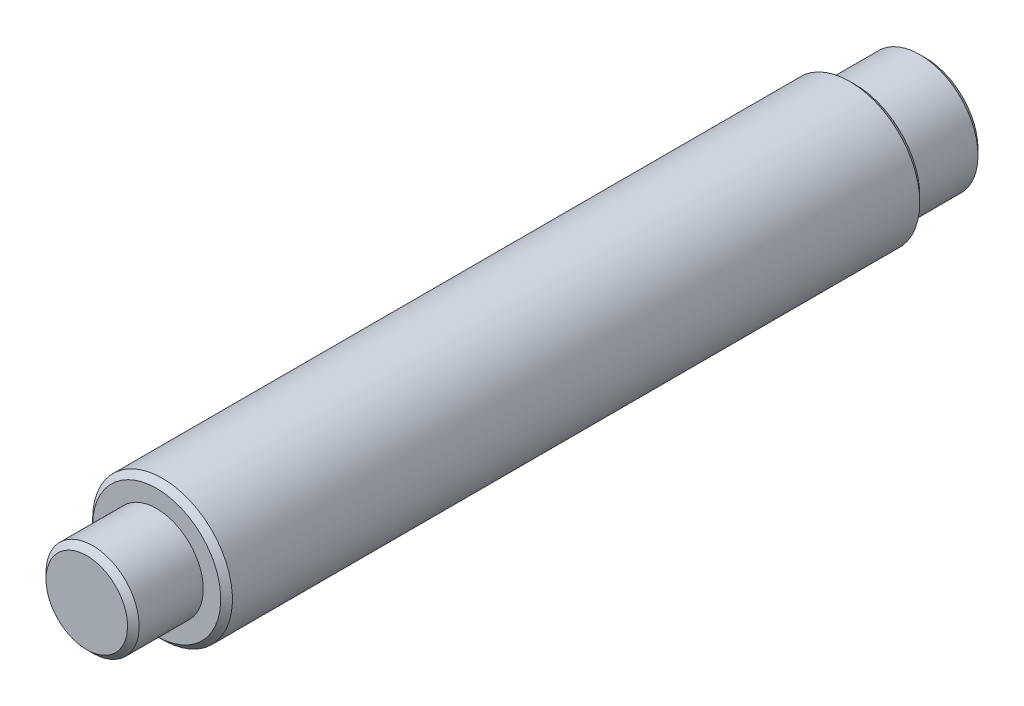
ISO-10303-21;
HEADER;
FILE_DESCRIPTION(('STEP AP214'),'2;1');
FILE_NAME('part.step','',(''),(''),'','','');
FILE_SCHEMA(('AUTOMOTIVE_DESIGN { 1 0 10303 214 1 1 1 1 }'));
ENDSEC;
DATA;
#1=APPLICATION_CONTEXT('core data for automotive mechanical design processes');
#2=APPLICATION_PROTOCOL_DEFINITION('international standard','automotive_design',2000,#1);
#3=PRODUCT_CONTEXT('',#1,'mechanical');
#4=PRODUCT('Part','Part','',(#3));
#5=PRODUCT_RELATED_PRODUCT_CATEGORY('part','',(#4));
#6=PRODUCT_DEFINITION_FORMATION('','',#4);
#7=PRODUCT_DEFINITION_CONTEXT('part definition',#1,'design');
#8=PRODUCT_DEFINITION('design','',#6,#7);
#9=PRODUCT_DEFINITION_SHAPE('','',#8);
#10=(LENGTH_UNIT() NAMED_UNIT(*) SI_UNIT(.MILLI.,.METRE.));
#11=(NAMED_UNIT(*) PLANE_ANGLE_UNIT() SI_UNIT($,.RADIAN.));
#12=(NAMED_UNIT(*) SI_UNIT($,.STERADIAN.) SOLID_ANGLE_UNIT());
#13=UNCERTAINTY_MEASURE_WITH_UNIT(LENGTH_MEASURE(1.E-05),#10,'distance_accuracy_value','');
#14=(GEOMETRIC_REPRESENTATION_CONTEXT(3) GLOBAL_UNCERTAINTY_ASSIGNED_CONTEXT((#13)) GLOBAL_UNIT_ASSIGNED_CONTEXT((#10,
#11,#12)) REPRESENTATION_CONTEXT('',''));
#15=CARTESIAN_POINT('',(0.,0.,0.));
#16=DIRECTION('',(0.,0.,1.));
#17=DIRECTION('',(1.,0.,0.));
#18=AXIS2_PLACEMENT_3D('',#15,#16,#17);
#19=CARTESIAN_POINT('',(0.,0.,6.));
#20=DIRECTION('',(0.,0.,-0.999999999999999));
#21=DIRECTION('',(-1.,0.,0.));
#22=AXIS2_PLACEMENT_3D('',#19,#20,#21);
#23=CYLINDRICAL_SURFACE('',#22,5.);
#24=CARTESIAN_POINT('',(0.,0.,0.500000000000007));
#25=DIRECTION('',(0.,0.,0.999999999999999));
#26=DIRECTION('',(1.,0.,0.));
#27=AXIS2_PLACEMENT_3D('',#24,#25,#26);
#28=CIRCLE('',#27,5.);
#29=CARTESIAN_POINT('',(-5.,0.,0.500000000000007));
#30=VERTEX_POINT('',#29);
#31=EDGE_CURVE('E42',#30,#30,#28,.T.);
#32=CARTESIAN_POINT('',(0.,0.,6.));
#33=DIRECTION('',(0.,0.,0.999999999999999));
#34=DIRECTION('',(1.,0.,0.));
#35=AXIS2_PLACEMENT_3D('',#32,#33,#34);
#36=CIRCLE('',#35,5.);
#37=CARTESIAN_POINT('',(-5.,0.,6.));
#38=VERTEX_POINT('',#37);
#39=EDGE_CURVE('E67',#38,#38,#36,.T.);
#40=CARTESIAN_POINT('',(-5.,0.,0.500000000000007));
#41=CARTESIAN_POINT('',(-5.,0.,0.557291666666674));
#42=CARTESIAN_POINT('',(-5.,0.,0.614583333333341));
#43=CARTESIAN_POINT('',(-5.,0.,0.729166666666674));
#44=CARTESIAN_POINT('',(-5.,0.,0.78645833333334));
#45=CARTESIAN_POINT('',(-5.,0.,0.901041666666674));
#46=CARTESIAN_POINT('',(-5.,0.,0.95833333333334));
#47=CARTESIAN_POINT('',(-5.,0.,1.07291666666667));
#48=CARTESIAN_POINT('',(-5.,0.,1.13020833333334));
#49=CARTESIAN_POINT('',(-5.,0.,1.24479166666667));
#50=CARTESIAN_POINT('',(-5.,0.,1.30208333333334));
#51=CARTESIAN_POINT('',(-5.,0.,1.41666666666667));
#52=CARTESIAN_POINT('',(-5.,0.,1.47395833333334));
#53=CARTESIAN_POINT('',(-5.,0.,1.58854166666667));
#54=CARTESIAN_POINT('',(-5.,0.,1.64583333333334));
#55=CARTESIAN_POINT('',(-5.,0.,1.76041666666667));
#56=CARTESIAN_POINT('',(-5.,0.,1.81770833333334));
#57=CARTESIAN_POINT('',(-5.,0.,1.93229166666667));
#58=CARTESIAN_POINT('',(-5.,0.,1.98958333333334));
#59=CARTESIAN_POINT('',(-5.,0.,2.10416666666667));
#60=CARTESIAN_POINT('',(-5.,0.,2.16145833333334));
#61=CARTESIAN_POINT('',(-5.,0.,2.27604166666667));
#62=CARTESIAN_POINT('',(-5.,0.,2.33333333333334));
#63=CARTESIAN_POINT('',(-5.,0.,2.44791666666667));
#64=CARTESIAN_POINT('',(-5.,0.,2.50520833333334));
#65=CARTESIAN_POINT('',(-5.,0.,2.61979166666667));
#66=CARTESIAN_POINT('',(-5.,0.,2.67708333333334));
#67=CARTESIAN_POINT('',(-5.,0.,2.79166666666667));
#68=CARTESIAN_POINT('',(-5.,0.,2.84895833333334));
#69=CARTESIAN_POINT('',(-5.,0.,2.96354166666667));
#70=CARTESIAN_POINT('',(-5.,0.,3.02083333333334));
#71=CARTESIAN_POINT('',(-5.,0.,3.13541666666667));
#72=CARTESIAN_POINT('',(-5.,0.,3.19270833333334));
#73=CARTESIAN_POINT('',(-5.,0.,3.30729166666667));
#74=CARTESIAN_POINT('',(-5.,0.,3.36458333333334));
#75=CARTESIAN_POINT('',(-5.,0.,3.47916666666667));
#76=CARTESIAN_POINT('',(-5.,0.,3.53645833333334));
#77=CARTESIAN_POINT('',(-5.,0.,3.65104166666667));
#78=CARTESIAN_POINT('',(-5.,0.,3.70833333333334));
#79=CARTESIAN_POINT('',(-5.,0.,3.82291666666667));
#80=CARTESIAN_POINT('',(-5.,0.,3.88020833333334));
#81=CARTESIAN_POINT('',(-5.,0.,3.99479166666667));
#82=CARTESIAN_POINT('',(-5.,0.,4.05208333333334));
#83=CARTESIAN_POINT('',(-5.,0.,4.16666666666667));
#84=CARTESIAN_POINT('',(-5.,0.,4.22395833333333));
#85=CARTESIAN_POINT('',(-5.,0.,4.33854166666667));
#86=CARTESIAN_POINT('',(-5.,0.,4.39583333333333));
#87=CARTESIAN_POINT('',(-5.,0.,4.51041666666667));
#88=CARTESIAN_POINT('',(-5.,0.,4.56770833333333));
#89=CARTESIAN_POINT('',(-5.,0.,4.68229166666667));
#90=CARTESIAN_POINT('',(-5.,0.,4.73958333333333));
#91=CARTESIAN_POINT('',(-5.,0.,4.85416666666667));
#92=CARTESIAN_POINT('',(-5.,0.,4.91145833333333));
#93=CARTESIAN_POINT('',(-5.,0.,5.02604166666667));
#94=CARTESIAN_POINT('',(-5.,0.,5.08333333333333));
#95=CARTESIAN_POINT('',(-5.,0.,5.19791666666667));
#96=CARTESIAN_POINT('',(-5.,0.,5.25520833333333));
#97=CARTESIAN_POINT('',(-5.,0.,5.36979166666667));
#98=CARTESIAN_POINT('',(-5.,0.,5.42708333333333));
#99=CARTESIAN_POINT('',(-5.,0.,5.54166666666667));
#100=CARTESIAN_POINT('',(-5.,0.,5.59895833333333));
#101=CARTESIAN_POINT('',(-5.,0.,5.71354166666667));
#102=CARTESIAN_POINT('',(-5.,0.,5.77083333333333));
#103=CARTESIAN_POINT('',(-5.,0.,5.88541666666666));
#104=CARTESIAN_POINT('',(-5.,0.,5.94270833333333));
#105=CARTESIAN_POINT('',(-5.,0.,6.));
#106=B_SPLINE_CURVE_WITH_KNOTS('',3,(#40,#41,#42,#43,#44,#45,#46,#47,#48,#49,#50,#51,#52,#53,
#54,#55,#56,#57,#58,#59,#60,#61,#62,#63,#64,#65,#66,#67,#68,#69,#70,#71,#72,#73,#74,#75,#76,#77,
#78,#79,#80,#81,#82,#83,#84,#85,#86,#87,#88,#89,#90,#91,#92,#93,#94,#95,#96,#97,#98,#99,#100,
#101,#102,#103,#104,#105),.UNSPECIFIED.,.F.,.F.,(4,2,2,2,2,2,2,2,2,2,2,2,2,2,2,2,2,2,2,2,2,2,2,
2,2,2,2,2,2,2,2,2,4),(0.,0.171875,0.343749999999999,0.515625,0.687499999999999,
0.859374999999999,1.03125,1.203125,1.375,1.546875,1.71875,1.890625,2.0625,2.234375,2.40625,
2.578125,2.75,2.921875,3.09375,3.26562499999999,3.43749999999999,3.60937499999999,
3.78124999999999,3.95312499999999,4.12499999999999,4.29687499999999,4.46874999999999,
4.64062499999999,4.81249999999999,4.98437499999999,5.15624999999999,5.32812499999999,
5.49999999999999),.UNSPECIFIED.);
#107=EDGE_CURVE('BSEAM30',#30,#38,#106,.T.);
#108=ORIENTED_EDGE('',*,*,#31,.T.);
#109=ORIENTED_EDGE('',*,*,#39,.F.);
#110=ORIENTED_EDGE('',*,*,#107,.T.);
#111=ORIENTED_EDGE('',*,*,#107,.F.);
#112=EDGE_LOOP('',(#108,#110,#109,#111));
#113=FACE_BOUND('',#112,.T.);
#114=ADVANCED_FACE('F30',(#113),#23,.T.);
#115=CARTESIAN_POINT('',(0.,0.,0.));
#116=DIRECTION('',(0.,0.,0.999999999999999));
#117=DIRECTION('',(1.,0.,0.));
#118=AXIS2_PLACEMENT_3D('',#115,#116,#117);
#119=PLANE('',#118);
#120=CARTESIAN_POINT('',(0.,0.,0.));
#121=DIRECTION('',(0.,0.,0.999999999999999));
#122=DIRECTION('',(1.,0.,0.));
#123=AXIS2_PLACEMENT_3D('',#120,#121,#122);
#124=CIRCLE('',#123,4.5);
#125=CARTESIAN_POINT('',(4.5,0.,0.));
#126=VERTEX_POINT('',#125);
#127=EDGE_CURVE('E10',#126,#126,#124,.F.);
#128=ORIENTED_EDGE('',*,*,#127,.T.);
#129=EDGE_LOOP('',(#128));
#130=FACE_BOUND('',#129,.T.);
#131=ADVANCED_FACE('F97',(#130),#119,.F.);
#132=CARTESIAN_POINT('',(0.,0.,6.));
#133=DIRECTION('',(0.,0.,0.999999999999999));
#134=DIRECTION('',(1.,0.,0.));
#135=AXIS2_PLACEMENT_3D('',#132,#133,#134);
#136=PLANE('',#135);
#137=CARTESIAN_POINT('',(0.,0.,6.));
#138=DIRECTION('',(0.,0.,0.999999999999999));
#139=DIRECTION('',(1.,0.,0.));
#140=AXIS2_PLACEMENT_3D('',#137,#138,#139);
#141=CIRCLE('',#140,5.5);
#142=CARTESIAN_POINT('',(5.5,0.,6.));
#143=VERTEX_POINT('',#142);
#144=EDGE_CURVE('E46',#143,#143,#141,.F.);
#145=ORIENTED_EDGE('',*,*,#144,.T.);
#146=EDGE_LOOP('',(#145));
#147=FACE_BOUND('',#146,.T.);
#148=ORIENTED_EDGE('',*,*,#39,.T.);
#149=EDGE_LOOP('',(#148));
#150=FACE_BOUND('',#149,.T.);
#151=ADVANCED_FACE('F102',(#147,#150),#136,.F.);
#152=CARTESIAN_POINT('',(0.,0.,65.9999999999999));
#153=DIRECTION('',(0.,0.,-0.999999999999999));
#154=DIRECTION('',(-1.,0.,0.));
#155=AXIS2_PLACEMENT_3D('',#152,#153,#154);
#156=CYLINDRICAL_SURFACE('',#155,6.);
#157=CARTESIAN_POINT('',(0.,-6.00000000000001,46.5));
#158=CARTESIAN_POINT('',(0.133903918163791,-5.99999628290908,46.4999952878604));
#159=CARTESIAN_POINT('',(0.268039524991425,-5.99546656821165,46.4891786843994));
#160=CARTESIAN_POINT('',(0.532498019991113,-5.97780115788616,46.4463192619063));
#161=CARTESIAN_POINT('',(0.662810029808669,-5.96464300599791,46.4142210532184));
#162=CARTESIAN_POINT('',(0.915376593299226,-5.93112629106012,46.3301785119407));
#163=CARTESIAN_POINT('',(1.03765681434384,-5.91079213642029,46.2783014076769));
#164=CARTESIAN_POINT('',(1.27165974779733,-5.8649055925345,46.1564541669781));
#165=CARTESIAN_POINT('',(1.38338564416288,-5.83935478441347,46.0864895110252));
#166=CARTESIAN_POINT('',(1.59889674004597,-5.78415660619864,45.9267420881924));
#167=CARTESIAN_POINT('',(1.70208251703042,-5.75437507703433,45.8361973967483));
#168=CARTESIAN_POINT('',(1.8923196601971,-5.69465427085228,45.6394713160995));
#169=CARTESIAN_POINT('',(1.9793625312399,-5.66471491925558,45.5332817462849));
#170=CARTESIAN_POINT('',(2.13907474876484,-5.60642043928224,45.3019464489894));
#171=CARTESIAN_POINT('',(2.21082616169411,-5.57821573827599,45.1761251042485));
#172=CARTESIAN_POINT('',(2.331878813161,-5.52871144633222,44.912853483057));
#173=CARTESIAN_POINT('',(2.38119161708799,-5.50740829980501,44.7754092407429));
#174=CARTESIAN_POINT('',(2.45349196589845,-5.47557110795537,44.4996926167384));
#175=CARTESIAN_POINT('',(2.47763315746001,-5.46456775308951,44.3617790332889));
#176=CARTESIAN_POINT('',(2.50250419944798,-5.45322652433633,44.0834534145536));
#177=CARTESIAN_POINT('',(2.5032469611117,-5.45288276849133,43.9430427999296));
#178=CARTESIAN_POINT('',(2.48216900725155,-5.46250239122985,43.6751998791475));
#179=CARTESIAN_POINT('',(2.46207362224014,-5.47167765447589,43.5475978068757));
#180=CARTESIAN_POINT('',(2.40278382032142,-5.49796965547249,43.2977758179945));
#181=CARTESIAN_POINT('',(2.36358574574513,-5.51508791407034,43.1755569370152));
#182=CARTESIAN_POINT('',(2.2664391745498,-5.55572369545608,42.9368845940184));
#183=CARTESIAN_POINT('',(2.20810943078429,-5.57936963898298,42.8206091581736));
#184=CARTESIAN_POINT('',(2.07462485161169,-5.63036662282146,42.5990445322393));
#185=CARTESIAN_POINT('',(1.99946338103922,-5.65771912259552,42.4937596987728));
#186=CARTESIAN_POINT('',(1.82699193108755,-5.71585953755967,42.2878000825344));
#187=CARTESIAN_POINT('',(1.72834696641502,-5.74674242808947,42.1882668652291));
#188=CARTESIAN_POINT('',(1.51545918210306,-5.80651346225056,42.0067729940816));
#189=CARTESIAN_POINT('',(1.40121271889693,-5.83540113754019,41.9248164566156));
#190=CARTESIAN_POINT('',(1.15689589738675,-5.88876567112946,41.7791283527674));
#191=CARTESIAN_POINT('',(1.02652116489536,-5.91312533086667,41.7158611096986));
#192=CARTESIAN_POINT('',(0.755704805053666,-5.95378962829607,41.6125577207934));
#193=CARTESIAN_POINT('',(0.615268789590073,-5.97009871691601,41.5725087361123));
#194=CARTESIAN_POINT('',(0.337856226692459,-5.9919928237277,41.5191680157467));
#195=CARTESIAN_POINT('',(0.201222570557281,-5.9981908209425,41.5043442851125));
#196=CARTESIAN_POINT('',(-0.072709310992175,-6.00112100737489,41.4973075527718));
#197=CARTESIAN_POINT('',(-0.210007334305268,-5.99785591423879,41.505088059496));
#198=CARTESIAN_POINT('',(-0.474196484682868,-5.98262435313881,41.5419421696121));
#199=CARTESIAN_POINT('',(-0.601265933278772,-5.97109774567979,41.5699399081944));
#200=CARTESIAN_POINT('',(-0.848765497942176,-5.94097213544829,41.6449363890815));
#201=CARTESIAN_POINT('',(-0.969194773036712,-5.92237223919408,41.6919375319006));
#202=CARTESIAN_POINT('',(-1.20421799973828,-5.87916541290331,41.8051419514242));
#203=CARTESIAN_POINT('',(-1.31851447371068,-5.85438982938561,41.871896366292));
#204=CARTESIAN_POINT('',(-1.53469243246282,-5.80147609158182,42.0221067555834));
#205=CARTESIAN_POINT('',(-1.63656870520375,-5.77333653537473,42.1055697030586));
#206=CARTESIAN_POINT('',(-1.83266686054868,-5.71424175790868,42.2938064665447));
#207=CARTESIAN_POINT('',(-1.92582139596023,-5.68322903182028,42.3996770059721));
#208=CARTESIAN_POINT('',(-2.09333969221046,-5.6236867353604,42.6260425518712));
#209=CARTESIAN_POINT('',(-2.16769918571027,-5.59515772986987,42.746540870345));
#210=CARTESIAN_POINT('',(-2.2963192041761,-5.54362772487864,43.0012283506035));
#211=CARTESIAN_POINT('',(-2.35027836475451,-5.52071125109802,43.1355880710237));
#212=CARTESIAN_POINT('',(-2.43434827902353,-5.48416711318335,43.4127411876261));
#213=CARTESIAN_POINT('',(-2.46447869724417,-5.47053179113074,43.5555275249887));
#214=CARTESIAN_POINT('',(-2.49808160700532,-5.4552632907308,43.833637398378));
#215=CARTESIAN_POINT('',(-2.50342760836084,-5.45278701929114,43.9686893245119));
#216=CARTESIAN_POINT('',(-2.49231151038001,-5.45787706027259,44.2376857223554));
#217=CARTESIAN_POINT('',(-2.47585275892879,-5.46544183100007,44.3716303609001));
#218=CARTESIAN_POINT('',(-2.42316809595845,-5.48899102586044,44.6281854946777));
#219=CARTESIAN_POINT('',(-2.38789807270203,-5.50456709625453,44.7510333459775));
#220=CARTESIAN_POINT('',(-2.29952656276963,-5.54206362465904,44.9890960436639));
#221=CARTESIAN_POINT('',(-2.24642006560089,-5.56398586515028,45.104308734336));
#222=CARTESIAN_POINT('',(-2.12020572373921,-5.61333908853253,45.331391788147));
#223=CARTESIAN_POINT('',(-2.04608723750137,-5.64102204404079,45.4426446459478));
#224=CARTESIAN_POINT('',(-1.88136812596239,-5.69807379131314,45.6517202931151));
#225=CARTESIAN_POINT('',(-1.79076178563716,-5.72744316520043,45.7495384050324));
#226=CARTESIAN_POINT('',(-1.58780416898838,-5.78712781593092,45.9362973056175));
#227=CARTESIAN_POINT('',(-1.47434977868814,-5.81735619175009,46.0240726428278));
#228=CARTESIAN_POINT('',(-1.23319985958043,-5.87320303099821,46.1793991300421));
#229=CARTESIAN_POINT('',(-1.1054978774169,-5.89881939160172,46.2469410639968));
#230=CARTESIAN_POINT('',(-0.841465213422199,-5.94218308378896,46.3584188704516));
#231=CARTESIAN_POINT('',(-0.705312056415873,-5.96005349044659,46.40272649429));
#232=CARTESIAN_POINT('',(-0.426816782070274,-5.9864223497589,46.4674156875296));
#233=CARTESIAN_POINT('',(-0.284495506121993,-5.99495014042422,46.4878721682058));
#234=CARTESIAN_POINT('',(-0.11805251234944,-5.99888566614292,46.4973238417862));
#235=CARTESIAN_POINT('',(-0.094456934879404,-5.99930292614998,46.498326602503));
#236=CARTESIAN_POINT('',(-0.0472433090693365,-5.99986042138656,46.4996650982567));
#237=CARTESIAN_POINT('',(-0.0236252606651506,-6.0000006558228,46.5000008313836));
#238=CARTESIAN_POINT('',(0.,-6.00000000000001,46.5));
#239=B_SPLINE_CURVE_WITH_KNOTS('',3,(#157,#158,#159,#160,#161,#162,#163,#164,#165,#166,#167,
#168,#169,#170,#171,#172,#173,#174,#175,#176,#177,#178,#179,#180,#181,#182,#183,#184,#185,#186,
#187,#188,#189,#190,#191,#192,#193,#194,#195,#196,#197,#198,#199,#200,#201,#202,#203,#204,#205,
#206,#207,#208,#209,#210,#211,#212,#213,#214,#215,#216,#217,#218,#219,#220,#221,#222,#223,#224,
#225,#226,#227,#228,#229,#230,#231,#232,#233,#234,#235,#236,#237,#238),.UNSPECIFIED.,.T.,.F.,(4,
2,2,2,2,2,2,2,2,2,2,2,2,2,2,2,2,2,2,2,2,2,2,2,2,2,2,2,2,2,2,2,2,2,2,2,2,2,2,2,4),(0.,
0.401613837767877,0.804277081257394,1.20558370381261,1.60676887370595,2.02635872577614,
2.44616876262931,2.88663449078251,3.32687293461176,3.74590546275116,4.16470676498093,
4.55140314405113,4.93817359454425,5.33317426117429,5.72833091434414,6.15688282255794,
6.58553498629177,7.02408110121628,7.46238448436595,7.87296886786503,8.28343534986345,
8.67353179471444,9.06367753203571,9.46594270544323,9.86837610938993,10.2995697605859,
10.7308612248068,11.1682957671905,11.6053689414916,12.0087975511929,12.4121642259507,
12.7967529992953,13.1814498990123,13.5892778679488,13.9972474685189,14.4349307000978,
14.8728129885717,15.3034571163877,15.7327450093864,15.8036033125922,15.8744618187069),.UNSPECIFIED.);
#240=CARTESIAN_POINT('',(0.,-6.00000000000001,46.5));
#241=VERTEX_POINT('',#240);
#242=EDGE_CURVE('E33',#241,#241,#239,.T.);
#243=ORIENTED_EDGE('',*,*,#242,.T.);
#244=EDGE_LOOP('',(#243));
#245=FACE_BOUND('',#244,.T.);
#246=CARTESIAN_POINT('',(0.,0.,65.4999999999999));
#247=DIRECTION('',(0.,0.,0.999999999999999));
#248=DIRECTION('',(1.,0.,0.));
#249=AXIS2_PLACEMENT_3D('',#246,#247,#248);
#250=CIRCLE('',#249,6.);
#251=CARTESIAN_POINT('',(-6.00000000000001,0.,65.4999999999999));
#252=VERTEX_POINT('',#251);
#253=EDGE_CURVE('E51',#252,#252,#250,.F.);
#254=ORIENTED_EDGE('',*,*,#253,.T.);
#255=EDGE_LOOP('',(#254));
#256=FACE_BOUND('',#255,.T.);
#257=CARTESIAN_POINT('',(0.,0.,6.50000000000001));
#258=DIRECTION('',(0.,0.,0.999999999999999));
#259=DIRECTION('',(1.,0.,0.));
#260=AXIS2_PLACEMENT_3D('',#257,#258,#259);
#261=CIRCLE('',#260,6.);
#262=CARTESIAN_POINT('',(6.,0.,6.50000000000001));
#263=VERTEX_POINT('',#262);
#264=EDGE_CURVE('E54',#263,#263,#261,.T.);
#265=ORIENTED_EDGE('',*,*,#264,.T.);
#266=EDGE_LOOP('',(#265));
#267=FACE_BOUND('',#266,.T.);
#268=ADVANCED_FACE('F79',(#245,#256,#267),#156,.T.);
#269=CARTESIAN_POINT('',(0.,0.,65.9999999999999));
#270=DIRECTION('',(0.,0.,0.999999999999999));
#271=DIRECTION('',(1.,0.,0.));
#272=AXIS2_PLACEMENT_3D('',#269,#270,#271);
#273=PLANE('',#272);
#274=CARTESIAN_POINT('',(0.,0.,65.9999999999999));
#275=DIRECTION('',(0.,0.,0.999999999999999));
#276=DIRECTION('',(1.,0.,0.));
#277=AXIS2_PLACEMENT_3D('',#274,#275,#276);
#278=CIRCLE('',#277,5.49999999999999);
#279=CARTESIAN_POINT('',(-5.5,0.,65.9999999999999));
#280=VERTEX_POINT('',#279);
#281=EDGE_CURVE('E57',#280,#280,#278,.T.);
#282=ORIENTED_EDGE('',*,*,#281,.T.);
#283=EDGE_LOOP('',(#282));
#284=FACE_BOUND('',#283,.T.);
#285=CARTESIAN_POINT('',(0.,0.,65.9999999999999));
#286=DIRECTION('',(0.,0.,0.999999999999999));
#287=DIRECTION('',(1.,0.,0.));
#288=AXIS2_PLACEMENT_3D('',#285,#286,#287);
#289=CIRCLE('',#288,4.);
#290=CARTESIAN_POINT('',(-4.,0.,65.9999999999999));
#291=VERTEX_POINT('',#290);
#292=EDGE_CURVE('E66',#291,#291,#289,.T.);
#293=ORIENTED_EDGE('',*,*,#292,.F.);
#294=EDGE_LOOP('',(#293));
#295=FACE_BOUND('',#294,.T.);
#296=ADVANCED_FACE('F113',(#284,#295),#273,.T.);
#297=CARTESIAN_POINT('',(0.,0.,71.9999999999999));
#298=DIRECTION('',(0.,0.,-0.999999999999999));
#299=DIRECTION('',(-1.,0.,0.));
#300=AXIS2_PLACEMENT_3D('',#297,#298,#299);
#301=CYLINDRICAL_SURFACE('',#300,4.);
#302=CARTESIAN_POINT('',(0.,0.,71.4999999999999));
#303=DIRECTION('',(0.,0.,0.999999999999999));
#304=DIRECTION('',(1.,0.,0.));
#305=AXIS2_PLACEMENT_3D('',#302,#303,#304);
#306=CIRCLE('',#305,4.);
#307=CARTESIAN_POINT('',(-4.,0.,71.4999999999999));
#308=VERTEX_POINT('',#307);
#309=EDGE_CURVE('E60',#308,#308,#306,.F.);
#310=CARTESIAN_POINT('',(-4.,0.,71.4999999999999));
#311=CARTESIAN_POINT('',(-4.,0.,71.4427083333332));
#312=CARTESIAN_POINT('',(-4.,0.,71.3854166666666));
#313=CARTESIAN_POINT('',(-4.,0.,71.2708333333333));
#314=CARTESIAN_POINT('',(-4.,0.,71.2135416666666));
#315=CARTESIAN_POINT('',(-4.,0.,71.0989583333333));
#316=CARTESIAN_POINT('',(-4.,0.,71.0416666666666));
#317=CARTESIAN_POINT('',(-4.,0.,70.9270833333333));
#318=CARTESIAN_POINT('',(-4.,0.,70.8697916666666));
#319=CARTESIAN_POINT('',(-4.,0.,70.7552083333332));
#320=CARTESIAN_POINT('',(-4.,0.,70.6979166666666));
#321=CARTESIAN_POINT('',(-4.,0.,70.5833333333332));
#322=CARTESIAN_POINT('',(-4.,0.,70.5260416666666));
#323=CARTESIAN_POINT('',(-4.,0.,70.4114583333332));
#324=CARTESIAN_POINT('',(-4.,0.,70.3541666666666));
#325=CARTESIAN_POINT('',(-4.,0.,70.2395833333332));
#326=CARTESIAN_POINT('',(-4.,0.,70.1822916666666));
#327=CARTESIAN_POINT('',(-4.,0.,70.0677083333332));
#328=CARTESIAN_POINT('',(-4.,0.,70.0104166666666));
#329=CARTESIAN_POINT('',(-4.,0.,69.8958333333333));
#330=CARTESIAN_POINT('',(-4.,0.,69.8385416666666));
#331=CARTESIAN_POINT('',(-4.,0.,69.7239583333333));
#332=CARTESIAN_POINT('',(-4.,0.,69.6666666666666));
#333=CARTESIAN_POINT('',(-4.,0.,69.5520833333333));
#334=CARTESIAN_POINT('',(-4.,0.,69.4947916666666));
#335=CARTESIAN_POINT('',(-4.,0.,69.3802083333332));
#336=CARTESIAN_POINT('',(-4.,0.,69.3229166666666));
#337=CARTESIAN_POINT('',(-4.,0.,69.2083333333332));
#338=CARTESIAN_POINT('',(-4.,0.,69.1510416666666));
#339=CARTESIAN_POINT('',(-4.,0.,69.0364583333332));
#340=CARTESIAN_POINT('',(-4.,0.,68.9791666666666));
#341=CARTESIAN_POINT('',(-4.,0.,68.8645833333332));
#342=CARTESIAN_POINT('',(-4.,0.,68.8072916666666));
#343=CARTESIAN_POINT('',(-4.,0.,68.6927083333332));
#344=CARTESIAN_POINT('',(-4.,0.,68.6354166666666));
#345=CARTESIAN_POINT('',(-4.,0.,68.5208333333333));
#346=CARTESIAN_POINT('',(-4.,0.,68.4635416666666));
#347=CARTESIAN_POINT('',(-4.,0.,68.3489583333333));
#348=CARTESIAN_POINT('',(-4.,0.,68.2916666666666));
#349=CARTESIAN_POINT('',(-4.,0.,68.1770833333332));
#350=CARTESIAN_POINT('',(-4.,0.,68.1197916666666));
#351=CARTESIAN_POINT('',(-4.,0.,68.0052083333332));
#352=CARTESIAN_POINT('',(-4.,0.,67.9479166666666));
#353=CARTESIAN_POINT('',(-4.,0.,67.8333333333332));
#354=CARTESIAN_POINT('',(-4.,0.,67.7760416666666));
#355=CARTESIAN_POINT('',(-4.,0.,67.6614583333332));
#356=CARTESIAN_POINT('',(-4.,0.,67.6041666666666));
#357=CARTESIAN_POINT('',(-4.,0.,67.4895833333332));
#358=CARTESIAN_POINT('',(-4.,0.,67.4322916666666));
#359=CARTESIAN_POINT('',(-4.,0.,67.3177083333332));
#360=CARTESIAN_POINT('',(-4.,0.,67.2604166666666));
#361=CARTESIAN_POINT('',(-4.,0.,67.1458333333333));
#362=CARTESIAN_POINT('',(-4.,0.,67.0885416666666));
#363=CARTESIAN_POINT('',(-4.,0.,66.9739583333332));
#364=CARTESIAN_POINT('',(-4.,0.,66.9166666666666));
#365=CARTESIAN_POINT('',(-4.,0.,66.8020833333332));
#366=CARTESIAN_POINT('',(-4.,0.,66.7447916666666));
#367=CARTESIAN_POINT('',(-4.,0.,66.6302083333332));
#368=CARTESIAN_POINT('',(-4.,0.,66.5729166666666));
#369=CARTESIAN_POINT('',(-4.,0.,66.4583333333332));
#370=CARTESIAN_POINT('',(-4.,0.,66.4010416666666));
#371=CARTESIAN_POINT('',(-4.,0.,66.2864583333332));
#372=CARTESIAN_POINT('',(-4.,0.,66.2291666666666));
#373=CARTESIAN_POINT('',(-4.,0.,66.1145833333332));
#374=CARTESIAN_POINT('',(-4.,0.,66.0572916666666));
#375=CARTESIAN_POINT('',(-4.,0.,65.9999999999999));
#376=B_SPLINE_CURVE_WITH_KNOTS('',3,(#310,#311,#312,#313,#314,#315,#316,#317,#318,#319,#320,
#321,#322,#323,#324,#325,#326,#327,#328,#329,#330,#331,#332,#333,#334,#335,#336,#337,#338,#339,
#340,#341,#342,#343,#344,#345,#346,#347,#348,#349,#350,#351,#352,#353,#354,#355,#356,#357,#358,
#359,#360,#361,#362,#363,#364,#365,#366,#367,#368,#369,#370,#371,#372,#373,#374,#375),
.UNSPECIFIED.,.F.,.F.,(4,2,2,2,2,2,2,2,2,2,2,2,2,2,2,2,2,2,2,2,2,2,2,2,2,2,2,2,2,2,2,2,4),(0.,
0.171874999999988,0.34374999999999,0.515624999999992,0.687499999999994,0.859374999999996,
1.03125,1.203125,1.375,1.54687499999999,1.71874999999999,1.89062499999999,2.06249999999999,
2.234375,2.40625,2.578125,2.75,2.92187499999999,3.09374999999999,3.26562499999999,3.4375,
3.609375,3.78125,3.953125,4.125,4.29687499999999,4.46874999999999,4.640625,4.8125,4.984375,
5.15625,5.328125,5.50000000000001),.UNSPECIFIED.);
#377=EDGE_CURVE('BSEAM116',#308,#291,#376,.T.);
#378=ORIENTED_EDGE('',*,*,#309,.T.);
#379=ORIENTED_EDGE('',*,*,#292,.T.);
#380=ORIENTED_EDGE('',*,*,#377,.T.);
#381=ORIENTED_EDGE('',*,*,#377,.F.);
#382=EDGE_LOOP('',(#378,#380,#379,#381));
#383=FACE_BOUND('',#382,.T.);
#384=ADVANCED_FACE('F116',(#383),#301,.T.);
#385=CARTESIAN_POINT('',(0.,0.,71.9999999999999));
#386=DIRECTION('',(0.,0.,0.999999999999999));
#387=DIRECTION('',(1.,0.,0.));
#388=AXIS2_PLACEMENT_3D('',#385,#386,#387);
#389=PLANE('',#388);
#390=CARTESIAN_POINT('',(0.,0.,71.9999999999999));
#391=DIRECTION('',(0.,0.,0.999999999999999));
#392=DIRECTION('',(1.,0.,0.));
#393=AXIS2_PLACEMENT_3D('',#390,#391,#392);
#394=CIRCLE('',#393,3.49999999999999);
#395=CARTESIAN_POINT('',(-3.5,0.,71.9999999999999));
#396=VERTEX_POINT('',#395);
#397=EDGE_CURVE('E63',#396,#396,#394,.T.);
#398=ORIENTED_EDGE('',*,*,#397,.T.);
#399=EDGE_LOOP('',(#398));
#400=FACE_BOUND('',#399,.T.);
#401=ADVANCED_FACE('F124',(#400),#389,.T.);
#402=CARTESIAN_POINT('',(0.,0.,71.9999999999999));
#403=DIRECTION('',(0.,0.,-0.999999999999999));
#404=DIRECTION('',(-1.,0.,0.));
#405=AXIS2_PLACEMENT_3D('',#402,#403,#404);
#406=CONICAL_SURFACE('',#405,3.49999999999999,0.785398163397457);
#407=CARTESIAN_POINT('',(-4.00000000000001,0.,71.4999999999999));
#408=CARTESIAN_POINT('',(-3.99479166666667,0.,71.5052083333333));
#409=CARTESIAN_POINT('',(-3.98958333333334,0.,71.5104166666666));
#410=CARTESIAN_POINT('',(-3.97916666666667,0.,71.5208333333333));
#411=CARTESIAN_POINT('',(-3.97395833333334,0.,71.5260416666666));
#412=CARTESIAN_POINT('',(-3.96354166666667,0.,71.5364583333332));
#413=CARTESIAN_POINT('',(-3.95833333333334,0.,71.5416666666666));
#414=CARTESIAN_POINT('',(-3.94791666666667,0.,71.5520833333333));
#415=CARTESIAN_POINT('',(-3.94270833333334,0.,71.5572916666666));
#416=CARTESIAN_POINT('',(-3.93229166666667,0.,71.5677083333333));
#417=CARTESIAN_POINT('',(-3.92708333333334,0.,71.5729166666666));
#418=CARTESIAN_POINT('',(-3.91666666666667,0.,71.5833333333332));
#419=CARTESIAN_POINT('',(-3.91145833333334,0.,71.5885416666666));
#420=CARTESIAN_POINT('',(-3.90104166666667,0.,71.5989583333333));
#421=CARTESIAN_POINT('',(-3.89583333333334,0.,71.6041666666666));
#422=CARTESIAN_POINT('',(-3.88541666666667,0.,71.6145833333332));
#423=CARTESIAN_POINT('',(-3.88020833333334,0.,71.6197916666666));
#424=CARTESIAN_POINT('',(-3.86979166666667,0.,71.6302083333333));
#425=CARTESIAN_POINT('',(-3.86458333333334,0.,71.6354166666666));
#426=CARTESIAN_POINT('',(-3.85416666666667,0.,71.6458333333333));
#427=CARTESIAN_POINT('',(-3.84895833333334,0.,71.6510416666666));
#428=CARTESIAN_POINT('',(-3.83854166666667,0.,71.6614583333332));
#429=CARTESIAN_POINT('',(-3.83333333333334,0.,71.6666666666666));
#430=CARTESIAN_POINT('',(-3.82291666666667,0.,71.6770833333333));
#431=CARTESIAN_POINT('',(-3.81770833333334,0.,71.6822916666666));
#432=CARTESIAN_POINT('',(-3.80729166666667,0.,71.6927083333333));
#433=CARTESIAN_POINT('',(-3.80208333333334,0.,71.6979166666666));
#434=CARTESIAN_POINT('',(-3.79166666666667,0.,71.7083333333332));
#435=CARTESIAN_POINT('',(-3.78645833333334,0.,71.7135416666666));
#436=CARTESIAN_POINT('',(-3.77604166666667,0.,71.7239583333333));
#437=CARTESIAN_POINT('',(-3.77083333333334,0.,71.7291666666666));
#438=CARTESIAN_POINT('',(-3.76041666666667,0.,71.7395833333332));
#439=CARTESIAN_POINT('',(-3.75520833333334,0.,71.7447916666666));
#440=CARTESIAN_POINT('',(-3.74479166666667,0.,71.7552083333333));
#441=CARTESIAN_POINT('',(-3.73958333333334,0.,71.7604166666666));
#442=CARTESIAN_POINT('',(-3.72916666666667,0.,71.7708333333333));
#443=CARTESIAN_POINT('',(-3.72395833333334,0.,71.7760416666666));
#444=CARTESIAN_POINT('',(-3.71354166666667,0.,71.7864583333332));
#445=CARTESIAN_POINT('',(-3.70833333333333,0.,71.7916666666666));
#446=CARTESIAN_POINT('',(-3.69791666666667,0.,71.8020833333333));
#447=CARTESIAN_POINT('',(-3.69270833333333,0.,71.8072916666666));
#448=CARTESIAN_POINT('',(-3.68229166666667,0.,71.8177083333333));
#449=CARTESIAN_POINT('',(-3.67708333333334,0.,71.8229166666666));
#450=CARTESIAN_POINT('',(-3.66666666666667,0.,71.8333333333332));
#451=CARTESIAN_POINT('',(-3.66145833333333,0.,71.8385416666666));
#452=CARTESIAN_POINT('',(-3.65104166666667,0.,71.8489583333333));
#453=CARTESIAN_POINT('',(-3.64583333333334,0.,71.8541666666666));
#454=CARTESIAN_POINT('',(-3.63541666666667,0.,71.8645833333332));
#455=CARTESIAN_POINT('',(-3.63020833333333,0.,71.8697916666666));
#456=CARTESIAN_POINT('',(-3.61979166666667,0.,71.8802083333333));
#457=CARTESIAN_POINT('',(-3.61458333333333,0.,71.8854166666666));
#458=CARTESIAN_POINT('',(-3.60416666666667,0.,71.8958333333333));
#459=CARTESIAN_POINT('',(-3.59895833333334,0.,71.9010416666666));
#460=CARTESIAN_POINT('',(-3.58854166666667,0.,71.9114583333332));
#461=CARTESIAN_POINT('',(-3.58333333333333,0.,71.9166666666666));
#462=CARTESIAN_POINT('',(-3.57291666666666,0.,71.9270833333333));
#463=CARTESIAN_POINT('',(-3.56770833333333,0.,71.9322916666666));
#464=CARTESIAN_POINT('',(-3.55729166666667,0.,71.9427083333333));
#465=CARTESIAN_POINT('',(-3.55208333333333,0.,71.9479166666666));
#466=CARTESIAN_POINT('',(-3.54166666666667,0.,71.9583333333332));
#467=CARTESIAN_POINT('',(-3.53645833333333,0.,71.9635416666666));
#468=CARTESIAN_POINT('',(-3.52604166666666,0.,71.9739583333333));
#469=CARTESIAN_POINT('',(-3.52083333333333,0.,71.9791666666666));
#470=CARTESIAN_POINT('',(-3.51041666666667,0.,71.9895833333333));
#471=CARTESIAN_POINT('',(-3.50520833333333,0.,71.9947916666666));
#472=CARTESIAN_POINT('',(-3.5,0.,71.9999999999999));
#473=B_SPLINE_CURVE_WITH_KNOTS('',3,(#407,#408,#409,#410,#411,#412,#413,#414,#415,#416,#417,
#418,#419,#420,#421,#422,#423,#424,#425,#426,#427,#428,#429,#430,#431,#432,#433,#434,#435,#436,
#437,#438,#439,#440,#441,#442,#443,#444,#445,#446,#447,#448,#449,#450,#451,#452,#453,#454,#455,
#456,#457,#458,#459,#460,#461,#462,#463,#464,#465,#466,#467,#468,#469,#470,#471,#472),
.UNSPECIFIED.,.F.,.F.,(4,2,2,2,2,2,2,2,2,2,2,2,2,2,2,2,2,2,2,2,2,2,2,2,2,2,2,2,2,2,2,2,4),(0.,
0.0220970869120833,0.0441941738241666,0.0662912607362401,0.088388347648324,0.110485434560407,
0.132582521472481,0.154679608384565,0.176776695296638,0.198873782208722,0.220970869120805,
0.243067956032879,0.265165042944962,0.287262129857046,0.30935921676912,0.331456303681203,
0.353553390593277,0.37565047750536,0.397747564417444,0.419844651329517,0.441941738241601,
0.464038825153684,0.486135912065758,0.508232998977841,0.530330085889915,0.552427172801999,
0.574524259714082,0.596621346626156,0.618718433538239,0.640815520450323,0.662912607362397,
0.68500969427448,0.707106781186564),.UNSPECIFIED.);
#474=EDGE_CURVE('BSEAM133',#308,#396,#473,.T.);
#475=ORIENTED_EDGE('',*,*,#309,.F.);
#476=ORIENTED_EDGE('',*,*,#397,.F.);
#477=ORIENTED_EDGE('',*,*,#474,.T.);
#478=ORIENTED_EDGE('',*,*,#474,.F.);
#479=EDGE_LOOP('',(#475,#477,#476,#478));
#480=FACE_BOUND('',#479,.T.);
#481=ADVANCED_FACE('F133',(#480),#406,.T.);
#482=CARTESIAN_POINT('',(0.,0.,65.9999999999999));
#483=DIRECTION('',(0.,0.,-0.999999999999999));
#484=DIRECTION('',(-1.,0.,0.));
#485=AXIS2_PLACEMENT_3D('',#482,#483,#484);
#486=CONICAL_SURFACE('',#485,5.49999999999999,0.785398163397457);
#487=CARTESIAN_POINT('',(-6.00000000000001,0.,65.4999999999999));
#488=CARTESIAN_POINT('',(-5.99479166666667,0.,65.5052083333332));
#489=CARTESIAN_POINT('',(-5.98958333333334,0.,65.5104166666666));
#490=CARTESIAN_POINT('',(-5.97916666666667,0.,65.5208333333333));
#491=CARTESIAN_POINT('',(-5.97395833333334,0.,65.5260416666666));
#492=CARTESIAN_POINT('',(-5.96354166666667,0.,65.5364583333332));
#493=CARTESIAN_POINT('',(-5.95833333333334,0.,65.5416666666666));
#494=CARTESIAN_POINT('',(-5.94791666666667,0.,65.5520833333332));
#495=CARTESIAN_POINT('',(-5.94270833333334,0.,65.5572916666666));
#496=CARTESIAN_POINT('',(-5.93229166666667,0.,65.5677083333333));
#497=CARTESIAN_POINT('',(-5.92708333333334,0.,65.5729166666666));
#498=CARTESIAN_POINT('',(-5.91666666666667,0.,65.5833333333332));
#499=CARTESIAN_POINT('',(-5.91145833333334,0.,65.5885416666666));
#500=CARTESIAN_POINT('',(-5.90104166666667,0.,65.5989583333332));
#501=CARTESIAN_POINT('',(-5.89583333333334,0.,65.6041666666666));
#502=CARTESIAN_POINT('',(-5.88541666666667,0.,65.6145833333332));
#503=CARTESIAN_POINT('',(-5.88020833333334,0.,65.6197916666666));
#504=CARTESIAN_POINT('',(-5.86979166666667,0.,65.6302083333332));
#505=CARTESIAN_POINT('',(-5.86458333333334,0.,65.6354166666666));
#506=CARTESIAN_POINT('',(-5.85416666666667,0.,65.6458333333333));
#507=CARTESIAN_POINT('',(-5.84895833333334,0.,65.6510416666666));
#508=CARTESIAN_POINT('',(-5.83854166666667,0.,65.6614583333332));
#509=CARTESIAN_POINT('',(-5.83333333333334,0.,65.6666666666666));
#510=CARTESIAN_POINT('',(-5.82291666666667,0.,65.6770833333332));
#511=CARTESIAN_POINT('',(-5.81770833333334,0.,65.6822916666666));
#512=CARTESIAN_POINT('',(-5.80729166666667,0.,65.6927083333333));
#513=CARTESIAN_POINT('',(-5.80208333333334,0.,65.6979166666666));
#514=CARTESIAN_POINT('',(-5.79166666666667,0.,65.7083333333332));
#515=CARTESIAN_POINT('',(-5.78645833333334,0.,65.7135416666666));
#516=CARTESIAN_POINT('',(-5.77604166666667,0.,65.7239583333332));
#517=CARTESIAN_POINT('',(-5.77083333333334,0.,65.7291666666666));
#518=CARTESIAN_POINT('',(-5.76041666666667,0.,65.7395833333332));
#519=CARTESIAN_POINT('',(-5.75520833333334,0.,65.7447916666666));
#520=CARTESIAN_POINT('',(-5.74479166666667,0.,65.7552083333332));
#521=CARTESIAN_POINT('',(-5.73958333333334,0.,65.7604166666666));
#522=CARTESIAN_POINT('',(-5.72916666666667,0.,65.7708333333333));
#523=CARTESIAN_POINT('',(-5.72395833333334,0.,65.7760416666666));
#524=CARTESIAN_POINT('',(-5.71354166666667,0.,65.7864583333332));
#525=CARTESIAN_POINT('',(-5.70833333333333,0.,65.7916666666666));
#526=CARTESIAN_POINT('',(-5.69791666666667,0.,65.8020833333332));
#527=CARTESIAN_POINT('',(-5.69270833333333,0.,65.8072916666666));
#528=CARTESIAN_POINT('',(-5.68229166666667,0.,65.8177083333333));
#529=CARTESIAN_POINT('',(-5.67708333333334,0.,65.8229166666666));
#530=CARTESIAN_POINT('',(-5.66666666666667,0.,65.8333333333332));
#531=CARTESIAN_POINT('',(-5.66145833333333,0.,65.8385416666666));
#532=CARTESIAN_POINT('',(-5.65104166666667,0.,65.8489583333332));
#533=CARTESIAN_POINT('',(-5.64583333333334,0.,65.8541666666666));
#534=CARTESIAN_POINT('',(-5.63541666666667,0.,65.8645833333332));
#535=CARTESIAN_POINT('',(-5.63020833333333,0.,65.8697916666666));
#536=CARTESIAN_POINT('',(-5.61979166666667,0.,65.8802083333332));
#537=CARTESIAN_POINT('',(-5.61458333333333,0.,65.8854166666666));
#538=CARTESIAN_POINT('',(-5.60416666666667,0.,65.8958333333333));
#539=CARTESIAN_POINT('',(-5.59895833333333,0.,65.9010416666666));
#540=CARTESIAN_POINT('',(-5.58854166666667,0.,65.9114583333332));
#541=CARTESIAN_POINT('',(-5.58333333333333,0.,65.9166666666666));
#542=CARTESIAN_POINT('',(-5.57291666666667,0.,65.9270833333332));
#543=CARTESIAN_POINT('',(-5.56770833333333,0.,65.9322916666666));
#544=CARTESIAN_POINT('',(-5.55729166666667,0.,65.9427083333333));
#545=CARTESIAN_POINT('',(-5.55208333333333,0.,65.9479166666666));
#546=CARTESIAN_POINT('',(-5.54166666666667,0.,65.9583333333332));
#547=CARTESIAN_POINT('',(-5.53645833333333,0.,65.9635416666666));
#548=CARTESIAN_POINT('',(-5.52604166666666,0.,65.9739583333332));
#549=CARTESIAN_POINT('',(-5.52083333333333,0.,65.9791666666666));
#550=CARTESIAN_POINT('',(-5.51041666666667,0.,65.9895833333333));
#551=CARTESIAN_POINT('',(-5.50520833333333,0.,65.9947916666666));
#552=CARTESIAN_POINT('',(-5.5,0.,65.9999999999999));
#553=B_SPLINE_CURVE_WITH_KNOTS('',3,(#487,#488,#489,#490,#491,#492,#493,#494,#495,#496,#497,
#498,#499,#500,#501,#502,#503,#504,#505,#506,#507,#508,#509,#510,#511,#512,#513,#514,#515,#516,
#517,#518,#519,#520,#521,#522,#523,#524,#525,#526,#527,#528,#529,#530,#531,#532,#533,#534,#535,
#536,#537,#538,#539,#540,#541,#542,#543,#544,#545,#546,#547,#548,#549,#550,#551,#552),
.UNSPECIFIED.,.F.,.F.,(4,2,2,2,2,2,2,2,2,2,2,2,2,2,2,2,2,2,2,2,2,2,2,2,2,2,2,2,2,2,2,2,4),(0.,
0.0220970869120839,0.0441941738241672,0.0662912607362414,0.0883883476483247,0.110485434560408,
0.132582521472481,0.154679608384565,0.176776695296639,0.198873782208722,0.220970869120806,
0.24306795603288,0.265165042944963,0.287262129857047,0.30935921676912,0.331456303681204,
0.353553390593278,0.375650477505361,0.397747564417444,0.419844651329519,0.441941738241602,
0.464038825153685,0.486135912065759,0.508232998977843,0.530330085889916,0.552427172802,
0.574524259714083,0.596621346626157,0.618718433538241,0.640815520450324,0.662912607362398,
0.685009694274482,0.707106781186565),.UNSPECIFIED.);
#554=EDGE_CURVE('BSEAM131',#252,#280,#553,.T.);
#555=ORIENTED_EDGE('',*,*,#253,.F.);
#556=ORIENTED_EDGE('',*,*,#281,.F.);
#557=ORIENTED_EDGE('',*,*,#554,.T.);
#558=ORIENTED_EDGE('',*,*,#554,.F.);
#559=EDGE_LOOP('',(#555,#557,#556,#558));
#560=FACE_BOUND('',#559,.T.);
#561=ADVANCED_FACE('F131',(#560),#486,.T.);
#562=CARTESIAN_POINT('',(0.,0.,6.50000000000001));
#563=DIRECTION('',(0.,0.,0.999999999999999));
#564=DIRECTION('',(1.,0.,0.));
#565=AXIS2_PLACEMENT_3D('',#562,#563,#564);
#566=CONICAL_SURFACE('',#565,6.,0.785398163397445);
#567=CARTESIAN_POINT('',(5.5,0.,6.));
#568=CARTESIAN_POINT('',(5.50520833333333,0.,6.00520833333333));
#569=CARTESIAN_POINT('',(5.51041666666666,0.,6.01041666666667));
#570=CARTESIAN_POINT('',(5.52083333333333,0.,6.02083333333333));
#571=CARTESIAN_POINT('',(5.52604166666666,0.,6.02604166666667));
#572=CARTESIAN_POINT('',(5.53645833333333,0.,6.03645833333333));
#573=CARTESIAN_POINT('',(5.54166666666666,0.,6.04166666666667));
#574=CARTESIAN_POINT('',(5.55208333333333,0.,6.05208333333333));
#575=CARTESIAN_POINT('',(5.55729166666666,0.,6.05729166666667));
#576=CARTESIAN_POINT('',(5.56770833333333,0.,6.06770833333333));
#577=CARTESIAN_POINT('',(5.57291666666666,0.,6.07291666666667));
#578=CARTESIAN_POINT('',(5.58333333333333,0.,6.08333333333333));
#579=CARTESIAN_POINT('',(5.58854166666666,0.,6.08854166666667));
#580=CARTESIAN_POINT('',(5.59895833333333,0.,6.09895833333333));
#581=CARTESIAN_POINT('',(5.60416666666666,0.,6.10416666666667));
#582=CARTESIAN_POINT('',(5.61458333333333,0.,6.11458333333333));
#583=CARTESIAN_POINT('',(5.61979166666666,0.,6.11979166666667));
#584=CARTESIAN_POINT('',(5.63020833333333,0.,6.13020833333333));
#585=CARTESIAN_POINT('',(5.63541666666666,0.,6.13541666666667));
#586=CARTESIAN_POINT('',(5.64583333333333,0.,6.14583333333333));
#587=CARTESIAN_POINT('',(5.65104166666667,0.,6.15104166666667));
#588=CARTESIAN_POINT('',(5.66145833333333,0.,6.16145833333333));
#589=CARTESIAN_POINT('',(5.66666666666667,0.,6.16666666666667));
#590=CARTESIAN_POINT('',(5.67708333333333,0.,6.17708333333333));
#591=CARTESIAN_POINT('',(5.68229166666667,0.,6.18229166666667));
#592=CARTESIAN_POINT('',(5.69270833333333,0.,6.19270833333334));
#593=CARTESIAN_POINT('',(5.69791666666667,0.,6.19791666666667));
#594=CARTESIAN_POINT('',(5.70833333333333,0.,6.20833333333334));
#595=CARTESIAN_POINT('',(5.71354166666667,0.,6.21354166666667));
#596=CARTESIAN_POINT('',(5.72395833333333,0.,6.22395833333334));
#597=CARTESIAN_POINT('',(5.72916666666667,0.,6.22916666666667));
#598=CARTESIAN_POINT('',(5.73958333333333,0.,6.23958333333334));
#599=CARTESIAN_POINT('',(5.74479166666667,0.,6.24479166666667));
#600=CARTESIAN_POINT('',(5.75520833333333,0.,6.25520833333334));
#601=CARTESIAN_POINT('',(5.76041666666667,0.,6.26041666666667));
#602=CARTESIAN_POINT('',(5.77083333333333,0.,6.27083333333334));
#603=CARTESIAN_POINT('',(5.77604166666667,0.,6.27604166666667));
#604=CARTESIAN_POINT('',(5.78645833333333,0.,6.28645833333334));
#605=CARTESIAN_POINT('',(5.79166666666667,0.,6.29166666666667));
#606=CARTESIAN_POINT('',(5.80208333333333,0.,6.30208333333334));
#607=CARTESIAN_POINT('',(5.80729166666667,0.,6.30729166666667));
#608=CARTESIAN_POINT('',(5.81770833333333,0.,6.31770833333334));
#609=CARTESIAN_POINT('',(5.82291666666667,0.,6.32291666666667));
#610=CARTESIAN_POINT('',(5.83333333333333,0.,6.33333333333334));
#611=CARTESIAN_POINT('',(5.83854166666667,0.,6.33854166666667));
#612=CARTESIAN_POINT('',(5.84895833333333,0.,6.34895833333334));
#613=CARTESIAN_POINT('',(5.85416666666667,0.,6.35416666666667));
#614=CARTESIAN_POINT('',(5.86458333333333,0.,6.36458333333334));
#615=CARTESIAN_POINT('',(5.86979166666667,0.,6.36979166666667));
#616=CARTESIAN_POINT('',(5.88020833333333,0.,6.38020833333334));
#617=CARTESIAN_POINT('',(5.88541666666667,0.,6.38541666666667));
#618=CARTESIAN_POINT('',(5.89583333333333,0.,6.39583333333334));
#619=CARTESIAN_POINT('',(5.90104166666667,0.,6.40104166666667));
#620=CARTESIAN_POINT('',(5.91145833333333,0.,6.41145833333334));
#621=CARTESIAN_POINT('',(5.91666666666667,0.,6.41666666666667));
#622=CARTESIAN_POINT('',(5.92708333333333,0.,6.42708333333334));
#623=CARTESIAN_POINT('',(5.93229166666667,0.,6.43229166666667));
#624=CARTESIAN_POINT('',(5.94270833333333,0.,6.44270833333334));
#625=CARTESIAN_POINT('',(5.94791666666667,0.,6.44791666666667));
#626=CARTESIAN_POINT('',(5.95833333333333,0.,6.45833333333334));
#627=CARTESIAN_POINT('',(5.96354166666667,0.,6.46354166666667));
#628=CARTESIAN_POINT('',(5.97395833333333,0.,6.47395833333334));
#629=CARTESIAN_POINT('',(5.97916666666667,0.,6.47916666666667));
#630=CARTESIAN_POINT('',(5.98958333333333,0.,6.48958333333334));
#631=CARTESIAN_POINT('',(5.99479166666667,0.,6.49479166666667));
#632=CARTESIAN_POINT('',(6.,0.,6.50000000000001));
#633=B_SPLINE_CURVE_WITH_KNOTS('',3,(#567,#568,#569,#570,#571,#572,#573,#574,#575,#576,#577,
#578,#579,#580,#581,#582,#583,#584,#585,#586,#587,#588,#589,#590,#591,#592,#593,#594,#595,#596,
#597,#598,#599,#600,#601,#602,#603,#604,#605,#606,#607,#608,#609,#610,#611,#612,#613,#614,#615,
#616,#617,#618,#619,#620,#621,#622,#623,#624,#625,#626,#627,#628,#629,#630,#631,#632),
.UNSPECIFIED.,.F.,.F.,(4,2,2,2,2,2,2,2,2,2,2,2,2,2,2,2,2,2,2,2,2,2,2,2,2,2,2,2,2,2,2,2,4),(0.,
0.0220970869120796,0.0441941738241599,0.0662912607362395,0.0883883476483198,0.110485434560399,
0.132582521472479,0.154679608384559,0.176776695296639,0.198873782208719,0.220970869120799,
0.243067956032878,0.265165042944959,0.287262129857038,0.309359216769118,0.331456303681198,
0.353553390593278,0.375650477505358,0.397747564417438,0.419844651329517,0.441941738241598,
0.464038825153677,0.486135912065757,0.508232998977836,0.530330085889917,0.552427172801997,
0.574524259714077,0.596621346626156,0.618718433538237,0.640815520450316,0.662912607362396,
0.685009694274476,0.707106781186555),.UNSPECIFIED.);
#634=EDGE_CURVE('BSEAM92',#143,#263,#633,.T.);
#635=ORIENTED_EDGE('',*,*,#144,.F.);
#636=ORIENTED_EDGE('',*,*,#264,.F.);
#637=ORIENTED_EDGE('',*,*,#634,.T.);
#638=ORIENTED_EDGE('',*,*,#634,.F.);
#639=EDGE_LOOP('',(#635,#637,#636,#638));
#640=FACE_BOUND('',#639,.T.);
#641=ADVANCED_FACE('F92',(#640),#566,.T.);
#642=CARTESIAN_POINT('',(0.,0.,0.500000000000007));
#643=DIRECTION('',(0.,0.,0.999999999999999));
#644=DIRECTION('',(1.,0.,0.));
#645=AXIS2_PLACEMENT_3D('',#642,#643,#644);
#646=CONICAL_SURFACE('',#645,5.,0.785398163397443);
#647=ORIENTED_EDGE('',*,*,#127,.F.);
#648=EDGE_LOOP('',(#647));
#649=FACE_BOUND('',#648,.T.);
#650=ORIENTED_EDGE('',*,*,#31,.F.);
#651=EDGE_LOOP('',(#650));
#652=FACE_BOUND('',#651,.T.);
#653=ADVANCED_FACE('F85',(#649,#652),#646,.T.);
#654=CARTESIAN_POINT('',(0.,-7.,44.));
#655=DIRECTION('',(0.,1.,0.));
#656=DIRECTION('',(0.,0.,0.999999999999999));
#657=AXIS2_PLACEMENT_3D('',#654,#655,#656);
#658=CYLINDRICAL_SURFACE('',#657,2.5);
#659=CARTESIAN_POINT('',(0.,0.,44.));
#660=DIRECTION('',(0.,1.,0.));
#661=DIRECTION('',(0.,0.,0.999999999999999));
#662=AXIS2_PLACEMENT_3D('',#659,#660,#661);
#663=CIRCLE('',#662,2.5);
#664=CARTESIAN_POINT('',(0.,0.,46.5));
#665=VERTEX_POINT('',#664);
#666=EDGE_CURVE('E72',#665,#665,#663,.T.);
#667=ORIENTED_EDGE('',*,*,#666,.T.);
#668=EDGE_LOOP('',(#667));
#669=FACE_BOUND('',#668,.T.);
#670=ORIENTED_EDGE('',*,*,#242,.F.);
#671=EDGE_LOOP('',(#670));
#672=FACE_BOUND('',#671,.T.);
#673=ADVANCED_FACE('F82',(#669,#672),#658,.F.);
#674=CARTESIAN_POINT('',(0.,0.,44.));
#675=DIRECTION('',(0.,1.,0.));
#676=DIRECTION('',(0.,0.,0.999999999999999));
#677=AXIS2_PLACEMENT_3D('',#674,#675,#676);
#678=PLANE('',#677);
#679=ORIENTED_EDGE('',*,*,#666,.F.);
#680=EDGE_LOOP('',(#679));
#681=FACE_BOUND('',#680,.T.);
#682=ADVANCED_FACE('F84',(#681),#678,.F.);
#683=CLOSED_SHELL('',(#114,#131,#151,#268,#296,#384,#401,#481,#561,#641,#653,#673,#682));
#684=MANIFOLD_SOLID_BREP('B2',#683);
#685=ADVANCED_BREP_SHAPE_REPRESENTATION('',(#18,#684),#14);
#686=SHAPE_DEFINITION_REPRESENTATION(#9,#685);
ENDSEC;
END-ISO-10303-21;
